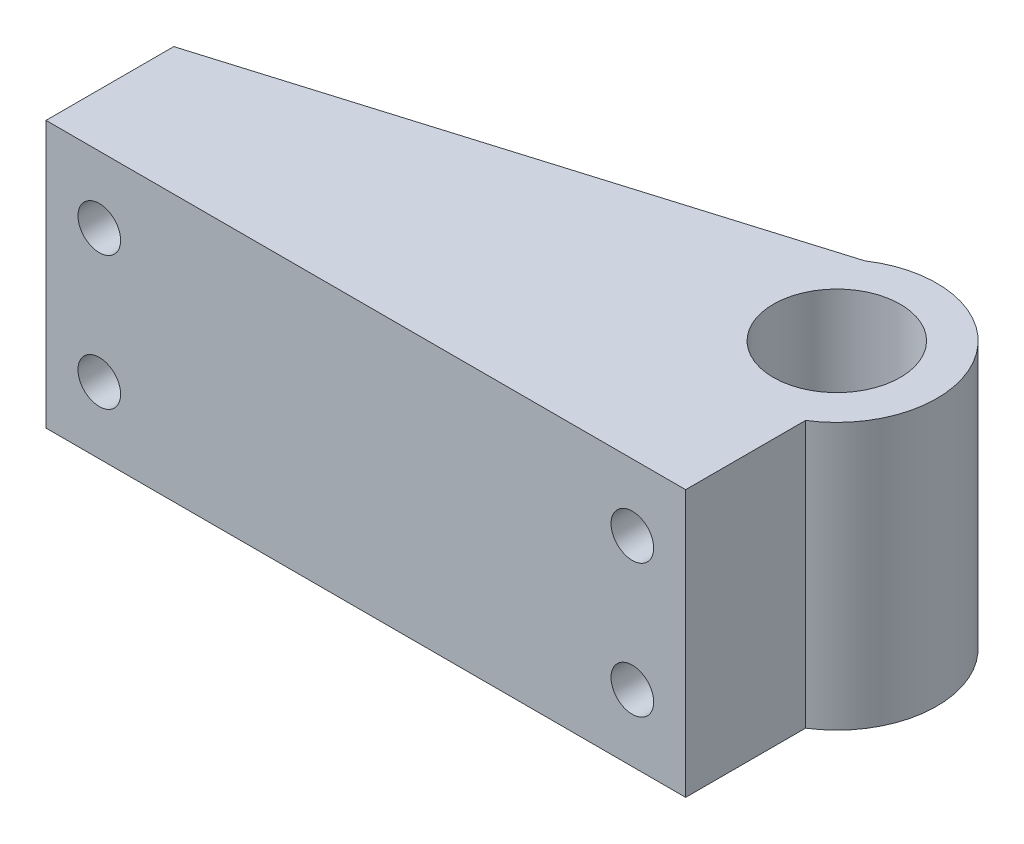
ISO-10303-21;
HEADER;
FILE_DESCRIPTION(('STEP AP214'),'2;1');
FILE_NAME('part.step','',(''),(''),'','','');
FILE_SCHEMA(('AUTOMOTIVE_DESIGN { 1 0 10303 214 1 1 1 1 }'));
ENDSEC;
DATA;
#1=APPLICATION_CONTEXT('core data for automotive mechanical design processes');
#2=APPLICATION_PROTOCOL_DEFINITION('international standard','automotive_design',2000,#1);
#3=PRODUCT_CONTEXT('',#1,'mechanical');
#4=PRODUCT('Part','Part','',(#3));
#5=PRODUCT_RELATED_PRODUCT_CATEGORY('part','',(#4));
#6=PRODUCT_DEFINITION_FORMATION('','',#4);
#7=PRODUCT_DEFINITION_CONTEXT('part definition',#1,'design');
#8=PRODUCT_DEFINITION('design','',#6,#7);
#9=PRODUCT_DEFINITION_SHAPE('','',#8);
#10=(LENGTH_UNIT() NAMED_UNIT(*) SI_UNIT(.MILLI.,.METRE.));
#11=(NAMED_UNIT(*) PLANE_ANGLE_UNIT() SI_UNIT($,.RADIAN.));
#12=(NAMED_UNIT(*) SI_UNIT($,.STERADIAN.) SOLID_ANGLE_UNIT());
#13=UNCERTAINTY_MEASURE_WITH_UNIT(LENGTH_MEASURE(1.E-05),#10,'distance_accuracy_value','');
#14=(GEOMETRIC_REPRESENTATION_CONTEXT(3) GLOBAL_UNCERTAINTY_ASSIGNED_CONTEXT((#13)) GLOBAL_UNIT_ASSIGNED_CONTEXT((#10,
#11,#12)) REPRESENTATION_CONTEXT('',''));
#15=CARTESIAN_POINT('',(0.,0.,0.));
#16=DIRECTION('',(0.,0.,1.));
#17=DIRECTION('',(1.,0.,0.));
#18=AXIS2_PLACEMENT_3D('',#15,#16,#17);
#19=CARTESIAN_POINT('',(0.,0.,0.));
#20=DIRECTION('',(0.,1.,0.));
#21=DIRECTION('',(0.,0.,1.));
#22=AXIS2_PLACEMENT_3D('',#19,#20,#21);
#23=PLANE('',#22);
#24=DIRECTION('',(1.,0.,0.));
#25=VECTOR('',#24,1.);
#26=CARTESIAN_POINT('',(0.,0.,19.4872467381854));
#27=LINE('',#26,#25);
#28=CARTESIAN_POINT('',(-55.88,0.,19.4872467381854));
#29=VERTEX_POINT('',#28);
#30=CARTESIAN_POINT('',(5.08,0.,19.4872467381854));
#31=VERTEX_POINT('',#30);
#32=EDGE_CURVE('E175',#29,#31,#27,.T.);
#33=ORIENTED_EDGE('',*,*,#32,.F.);
#34=DIRECTION('',(0.,0.,1.));
#35=VECTOR('',#34,1.);
#36=CARTESIAN_POINT('',(-55.88,0.,8.05724673818545));
#37=LINE('',#36,#35);
#38=CARTESIAN_POINT('',(-55.88,0.,7.3087196423991));
#39=VERTEX_POINT('',#38);
#40=EDGE_CURVE('E148',#39,#29,#37,.T.);
#41=ORIENTED_EDGE('',*,*,#40,.F.);
#42=DIRECTION('',(0.957496858882711,0.,-0.288443695077118));
#43=VECTOR('',#42,1.);
#44=CARTESIAN_POINT('',(-2.63065195230822,0.,-8.73252223618671));
#45=LINE('',#44,#43);
#46=CARTESIAN_POINT('',(-5.26130390461645,0.,-7.94004447237342));
#47=VERTEX_POINT('',#46);
#48=EDGE_CURVE('E135',#39,#47,#45,.T.);
#49=ORIENTED_EDGE('',*,*,#48,.T.);
#50=CARTESIAN_POINT('',(0.,0.,0.));
#51=DIRECTION('',(0.,1.,0.));
#52=DIRECTION('',(0.,0.,1.));
#53=AXIS2_PLACEMENT_3D('',#50,#51,#52);
#54=CIRCLE('',#53,9.525);
#55=CARTESIAN_POINT('',(5.08,0.,8.05724673818545));
#56=VERTEX_POINT('',#55);
#57=EDGE_CURVE('E208',#56,#47,#54,.T.);
#58=ORIENTED_EDGE('',*,*,#57,.F.);
#59=DIRECTION('',(0.,0.,1.));
#60=VECTOR('',#59,1.);
#61=CARTESIAN_POINT('',(5.08,0.,0.));
#62=LINE('',#61,#60);
#63=EDGE_CURVE('E176',#56,#31,#62,.T.);
#64=ORIENTED_EDGE('',*,*,#63,.T.);
#65=EDGE_LOOP('',(#33,#41,#49,#58,#64));
#66=FACE_BOUND('',#65,.T.);
#67=CARTESIAN_POINT('',(0.,0.,0.));
#68=DIRECTION('',(0.,1.,0.));
#69=DIRECTION('',(0.,0.,1.));
#70=AXIS2_PLACEMENT_3D('',#67,#68,#69);
#71=CIRCLE('',#70,6.049999965);
#72=CARTESIAN_POINT('',(0.,0.,6.049999965));
#73=VERTEX_POINT('',#72);
#74=EDGE_CURVE('E193',#73,#73,#71,.T.);
#75=ORIENTED_EDGE('',*,*,#74,.T.);
#76=EDGE_LOOP('',(#75));
#77=FACE_BOUND('',#76,.T.);
#78=ADVANCED_FACE('F126',(#66,#77),#23,.F.);
#79=CARTESIAN_POINT('',(0.,25.4,19.4872467381854));
#80=DIRECTION('',(0.,0.,-1.));
#81=DIRECTION('',(-1.,0.,0.));
#82=AXIS2_PLACEMENT_3D('',#79,#80,#81);
#83=PLANE('',#82);
#84=CARTESIAN_POINT('',(0.,6.35,19.4872467381854));
#85=DIRECTION('',(0.,0.,1.));
#86=DIRECTION('',(1.,0.,0.));
#87=AXIS2_PLACEMENT_3D('',#84,#85,#86);
#88=CIRCLE('',#87,2.032);
#89=CARTESIAN_POINT('',(2.032,6.35,19.4872467381854));
#90=VERTEX_POINT('',#89);
#91=EDGE_CURVE('E296',#90,#90,#88,.T.);
#92=ORIENTED_EDGE('',*,*,#91,.F.);
#93=EDGE_LOOP('',(#92));
#94=FACE_BOUND('',#93,.T.);
#95=CARTESIAN_POINT('',(-50.8,19.05,19.4872467381854));
#96=DIRECTION('',(0.,0.,1.));
#97=DIRECTION('',(1.,0.,0.));
#98=AXIS2_PLACEMENT_3D('',#95,#96,#97);
#99=CIRCLE('',#98,2.032);
#100=CARTESIAN_POINT('',(-48.768,19.05,19.4872467381854));
#101=VERTEX_POINT('',#100);
#102=EDGE_CURVE('E295',#101,#101,#99,.T.);
#103=ORIENTED_EDGE('',*,*,#102,.F.);
#104=EDGE_LOOP('',(#103));
#105=FACE_BOUND('',#104,.T.);
#106=CARTESIAN_POINT('',(-50.8,6.35,19.4872467381854));
#107=DIRECTION('',(0.,0.,1.));
#108=DIRECTION('',(1.,0.,0.));
#109=AXIS2_PLACEMENT_3D('',#106,#107,#108);
#110=CIRCLE('',#109,2.032);
#111=CARTESIAN_POINT('',(-48.768,6.35,19.4872467381854));
#112=VERTEX_POINT('',#111);
#113=EDGE_CURVE('E286',#112,#112,#110,.T.);
#114=ORIENTED_EDGE('',*,*,#113,.F.);
#115=EDGE_LOOP('',(#114));
#116=FACE_BOUND('',#115,.T.);
#117=CARTESIAN_POINT('',(0.,19.05,19.4872467381854));
#118=DIRECTION('',(0.,0.,1.));
#119=DIRECTION('',(1.,0.,0.));
#120=AXIS2_PLACEMENT_3D('',#117,#118,#119);
#121=CIRCLE('',#120,2.032);
#122=CARTESIAN_POINT('',(2.032,19.05,19.4872467381854));
#123=VERTEX_POINT('',#122);
#124=EDGE_CURVE('E301',#123,#123,#121,.T.);
#125=ORIENTED_EDGE('',*,*,#124,.F.);
#126=EDGE_LOOP('',(#125));
#127=FACE_BOUND('',#126,.T.);
#128=ORIENTED_EDGE('',*,*,#32,.T.);
#129=DIRECTION('',(0.,-1.,0.));
#130=VECTOR('',#129,1.);
#131=CARTESIAN_POINT('',(5.08,25.4,19.4872467381854));
#132=LINE('',#131,#130);
#133=CARTESIAN_POINT('',(5.08,25.4,19.4872467381854));
#134=VERTEX_POINT('',#133);
#135=EDGE_CURVE('E200',#134,#31,#132,.T.);
#136=ORIENTED_EDGE('',*,*,#135,.F.);
#137=DIRECTION('',(1.,0.,0.));
#138=VECTOR('',#137,1.);
#139=CARTESIAN_POINT('',(0.,25.4,19.4872467381854));
#140=LINE('',#139,#138);
#141=CARTESIAN_POINT('',(-55.88,25.4,19.4872467381854));
#142=VERTEX_POINT('',#141);
#143=EDGE_CURVE('E192',#142,#134,#140,.T.);
#144=ORIENTED_EDGE('',*,*,#143,.F.);
#145=DIRECTION('',(0.,1.,0.));
#146=VECTOR('',#145,1.);
#147=CARTESIAN_POINT('',(-55.88,0.,19.4872467381854));
#148=LINE('',#147,#146);
#149=EDGE_CURVE('E183',#29,#142,#148,.T.);
#150=ORIENTED_EDGE('',*,*,#149,.F.);
#151=EDGE_LOOP('',(#128,#136,#144,#150));
#152=FACE_BOUND('',#151,.T.);
#153=ADVANCED_FACE('F188',(#94,#105,#116,#127,#152),#83,.F.);
#154=CARTESIAN_POINT('',(0.,25.4,0.));
#155=DIRECTION('',(0.,1.,0.));
#156=DIRECTION('',(0.,0.,1.));
#157=AXIS2_PLACEMENT_3D('',#154,#155,#156);
#158=PLANE('',#157);
#159=ORIENTED_EDGE('',*,*,#143,.T.);
#160=DIRECTION('',(0.,0.,1.));
#161=VECTOR('',#160,1.);
#162=CARTESIAN_POINT('',(5.08,25.4,0.));
#163=LINE('',#162,#161);
#164=CARTESIAN_POINT('',(5.08,25.4,8.05724673818545));
#165=VERTEX_POINT('',#164);
#166=EDGE_CURVE('E181',#165,#134,#163,.T.);
#167=ORIENTED_EDGE('',*,*,#166,.F.);
#168=CARTESIAN_POINT('',(0.,25.4,0.));
#169=DIRECTION('',(0.,1.,0.));
#170=DIRECTION('',(0.,0.,1.));
#171=AXIS2_PLACEMENT_3D('',#168,#169,#170);
#172=CIRCLE('',#171,9.525);
#173=CARTESIAN_POINT('',(-5.26130390461645,25.4,-7.94004447237342));
#174=VERTEX_POINT('',#173);
#175=EDGE_CURVE('E202',#165,#174,#172,.T.);
#176=ORIENTED_EDGE('',*,*,#175,.T.);
#177=DIRECTION('',(-0.957496858882711,0.,0.288443695077118));
#178=VECTOR('',#177,1.);
#179=CARTESIAN_POINT('',(-58.3647564888267,25.4,8.05724673818545));
#180=LINE('',#179,#178);
#181=CARTESIAN_POINT('',(-55.88,25.4,7.3087196423991));
#182=VERTEX_POINT('',#181);
#183=EDGE_CURVE('E12',#174,#182,#180,.T.);
#184=ORIENTED_EDGE('',*,*,#183,.T.);
#185=DIRECTION('',(0.,0.,-1.));
#186=VECTOR('',#185,1.);
#187=CARTESIAN_POINT('',(-55.88,25.4,8.05724673818545));
#188=LINE('',#187,#186);
#189=EDGE_CURVE('E145',#142,#182,#188,.T.);
#190=ORIENTED_EDGE('',*,*,#189,.F.);
#191=EDGE_LOOP('',(#159,#167,#176,#184,#190));
#192=FACE_BOUND('',#191,.T.);
#193=CARTESIAN_POINT('',(0.,25.4,0.));
#194=DIRECTION('',(0.,1.,0.));
#195=DIRECTION('',(0.,0.,1.));
#196=AXIS2_PLACEMENT_3D('',#193,#194,#195);
#197=CIRCLE('',#196,6.049999965);
#198=CARTESIAN_POINT('',(0.,25.4,6.049999965));
#199=VERTEX_POINT('',#198);
#200=EDGE_CURVE('E210',#199,#199,#197,.T.);
#201=ORIENTED_EDGE('',*,*,#200,.F.);
#202=EDGE_LOOP('',(#201));
#203=FACE_BOUND('',#202,.T.);
#204=ADVANCED_FACE('F223',(#192,#203),#158,.T.);
#205=CARTESIAN_POINT('',(5.08,25.4,0.));
#206=DIRECTION('',(1.,0.,0.));
#207=DIRECTION('',(0.,0.,-1.));
#208=AXIS2_PLACEMENT_3D('',#205,#206,#207);
#209=PLANE('',#208);
#210=ORIENTED_EDGE('',*,*,#166,.T.);
#211=ORIENTED_EDGE('',*,*,#135,.T.);
#212=ORIENTED_EDGE('',*,*,#63,.F.);
#213=DIRECTION('',(0.,-1.,0.));
#214=VECTOR('',#213,1.);
#215=CARTESIAN_POINT('',(5.08,25.4,8.05724673818545));
#216=LINE('',#215,#214);
#217=EDGE_CURVE('E201',#165,#56,#216,.T.);
#218=ORIENTED_EDGE('',*,*,#217,.F.);
#219=EDGE_LOOP('',(#210,#211,#212,#218));
#220=FACE_BOUND('',#219,.T.);
#221=ADVANCED_FACE('F230',(#220),#209,.T.);
#222=CARTESIAN_POINT('',(0.,25.4,0.));
#223=DIRECTION('',(0.,-1.,0.));
#224=DIRECTION('',(0.,0.,-1.));
#225=AXIS2_PLACEMENT_3D('',#222,#223,#224);
#226=CYLINDRICAL_SURFACE('',#225,6.049999965);
#227=ORIENTED_EDGE('',*,*,#200,.T.);
#228=EDGE_LOOP('',(#227));
#229=FACE_BOUND('',#228,.T.);
#230=ORIENTED_EDGE('',*,*,#74,.F.);
#231=EDGE_LOOP('',(#230));
#232=FACE_BOUND('',#231,.T.);
#233=ADVANCED_FACE('F233',(#229,#232),#226,.F.);
#234=CARTESIAN_POINT('',(0.,25.4,0.));
#235=DIRECTION('',(0.,-1.,0.));
#236=DIRECTION('',(0.,0.,-1.));
#237=AXIS2_PLACEMENT_3D('',#234,#235,#236);
#238=CYLINDRICAL_SURFACE('',#237,9.525);
#239=ORIENTED_EDGE('',*,*,#57,.T.);
#240=DIRECTION('',(0.,-1.,0.));
#241=VECTOR('',#240,1.);
#242=CARTESIAN_POINT('',(-5.26130390461645,25.4,-7.94004447237342));
#243=LINE('',#242,#241);
#244=EDGE_CURVE('E207',#47,#174,#243,.F.);
#245=ORIENTED_EDGE('',*,*,#244,.T.);
#246=ORIENTED_EDGE('',*,*,#175,.F.);
#247=ORIENTED_EDGE('',*,*,#217,.T.);
#248=EDGE_LOOP('',(#239,#245,#246,#247));
#249=FACE_BOUND('',#248,.T.);
#250=ADVANCED_FACE('F224',(#249),#238,.T.);
#251=CARTESIAN_POINT('',(-55.88,0.,0.));
#252=DIRECTION('',(1.,0.,0.));
#253=DIRECTION('',(0.,0.,-1.));
#254=AXIS2_PLACEMENT_3D('',#251,#252,#253);
#255=PLANE('',#254);
#256=ORIENTED_EDGE('',*,*,#189,.T.);
#257=DIRECTION('',(0.,-1.,0.));
#258=VECTOR('',#257,1.);
#259=CARTESIAN_POINT('',(-55.88,0.,7.3087196423991));
#260=LINE('',#259,#258);
#261=EDGE_CURVE('E187',#182,#39,#260,.T.);
#262=ORIENTED_EDGE('',*,*,#261,.T.);
#263=ORIENTED_EDGE('',*,*,#40,.T.);
#264=ORIENTED_EDGE('',*,*,#149,.T.);
#265=EDGE_LOOP('',(#256,#262,#263,#264));
#266=FACE_BOUND('',#265,.T.);
#267=ADVANCED_FACE('F182',(#266),#255,.F.);
#268=CARTESIAN_POINT('',(-58.3647564888267,25.4,8.05724673818545));
#269=DIRECTION('',(0.288443695077118,0.,0.957496858882711));
#270=DIRECTION('',(0.,-1.,0.));
#271=AXIS2_PLACEMENT_3D('',#268,#269,#270);
#272=PLANE('',#271);
#273=ORIENTED_EDGE('',*,*,#183,.F.);
#274=ORIENTED_EDGE('',*,*,#244,.F.);
#275=ORIENTED_EDGE('',*,*,#48,.F.);
#276=ORIENTED_EDGE('',*,*,#261,.F.);
#277=EDGE_LOOP('',(#273,#274,#275,#276));
#278=FACE_BOUND('',#277,.T.);
#279=ADVANCED_FACE('F128',(#278),#272,.F.);
#280=CARTESIAN_POINT('',(0.,19.05,6.78724673818545));
#281=DIRECTION('',(0.,0.,1.));
#282=DIRECTION('',(1.,0.,0.));
#283=AXIS2_PLACEMENT_3D('',#280,#281,#282);
#284=CYLINDRICAL_SURFACE('',#283,2.032);
#285=CARTESIAN_POINT('',(0.,19.05,6.78724673818545));
#286=DIRECTION('',(0.,0.,1.));
#287=DIRECTION('',(1.,0.,0.));
#288=AXIS2_PLACEMENT_3D('',#285,#286,#287);
#289=CIRCLE('',#288,2.032);
#290=CARTESIAN_POINT('',(2.032,19.05,6.78724673818545));
#291=VERTEX_POINT('',#290);
#292=EDGE_CURVE('E189',#291,#291,#289,.T.);
#293=ORIENTED_EDGE('',*,*,#292,.F.);
#294=EDGE_LOOP('',(#293));
#295=FACE_BOUND('',#294,.T.);
#296=ORIENTED_EDGE('',*,*,#124,.T.);
#297=EDGE_LOOP('',(#296));
#298=FACE_BOUND('',#297,.T.);
#299=ADVANCED_FACE('F249',(#295,#298),#284,.F.);
#300=CARTESIAN_POINT('',(0.,19.05,6.78724673818545));
#301=DIRECTION('',(0.,0.,1.));
#302=DIRECTION('',(1.,0.,0.));
#303=AXIS2_PLACEMENT_3D('',#300,#301,#302);
#304=PLANE('',#303);
#305=ORIENTED_EDGE('',*,*,#292,.T.);
#306=EDGE_LOOP('',(#305));
#307=FACE_BOUND('',#306,.T.);
#308=ADVANCED_FACE('F254',(#307),#304,.T.);
#309=CARTESIAN_POINT('',(-50.8,6.35,6.78724673818545));
#310=DIRECTION('',(0.,0.,1.));
#311=DIRECTION('',(1.,0.,0.));
#312=AXIS2_PLACEMENT_3D('',#309,#310,#311);
#313=CYLINDRICAL_SURFACE('',#312,2.032);
#314=CARTESIAN_POINT('',(-50.8,6.35,6.78724673818545));
#315=DIRECTION('',(0.,0.,1.));
#316=DIRECTION('',(1.,0.,0.));
#317=AXIS2_PLACEMENT_3D('',#314,#315,#316);
#318=CIRCLE('',#317,2.032);
#319=CARTESIAN_POINT('',(-48.768,6.35,6.78724673818545));
#320=VERTEX_POINT('',#319);
#321=EDGE_CURVE('E287',#320,#320,#318,.T.);
#322=ORIENTED_EDGE('',*,*,#321,.F.);
#323=EDGE_LOOP('',(#322));
#324=FACE_BOUND('',#323,.T.);
#325=ORIENTED_EDGE('',*,*,#113,.T.);
#326=EDGE_LOOP('',(#325));
#327=FACE_BOUND('',#326,.T.);
#328=ADVANCED_FACE('F257',(#324,#327),#313,.F.);
#329=CARTESIAN_POINT('',(-50.8,6.35,6.78724673818545));
#330=DIRECTION('',(0.,0.,1.));
#331=DIRECTION('',(1.,0.,0.));
#332=AXIS2_PLACEMENT_3D('',#329,#330,#331);
#333=PLANE('',#332);
#334=ORIENTED_EDGE('',*,*,#321,.T.);
#335=EDGE_LOOP('',(#334));
#336=FACE_BOUND('',#335,.T.);
#337=ADVANCED_FACE('F269',(#336),#333,.T.);
#338=CARTESIAN_POINT('',(-50.8,19.05,6.78724673818545));
#339=DIRECTION('',(0.,0.,1.));
#340=DIRECTION('',(1.,0.,0.));
#341=AXIS2_PLACEMENT_3D('',#338,#339,#340);
#342=CYLINDRICAL_SURFACE('',#341,2.032);
#343=CARTESIAN_POINT('',(-50.8,19.05,6.78724673818545));
#344=DIRECTION('',(0.,0.,1.));
#345=DIRECTION('',(1.,0.,0.));
#346=AXIS2_PLACEMENT_3D('',#343,#344,#345);
#347=CIRCLE('',#346,2.032);
#348=CARTESIAN_POINT('',(-48.768,19.05,6.78724673818545));
#349=VERTEX_POINT('',#348);
#350=EDGE_CURVE('E293',#349,#349,#347,.T.);
#351=ORIENTED_EDGE('',*,*,#350,.F.);
#352=EDGE_LOOP('',(#351));
#353=FACE_BOUND('',#352,.T.);
#354=ORIENTED_EDGE('',*,*,#102,.T.);
#355=EDGE_LOOP('',(#354));
#356=FACE_BOUND('',#355,.T.);
#357=ADVANCED_FACE('F264',(#353,#356),#342,.F.);
#358=CARTESIAN_POINT('',(-50.8,19.05,6.78724673818545));
#359=DIRECTION('',(0.,0.,1.));
#360=DIRECTION('',(1.,0.,0.));
#361=AXIS2_PLACEMENT_3D('',#358,#359,#360);
#362=PLANE('',#361);
#363=ORIENTED_EDGE('',*,*,#350,.T.);
#364=EDGE_LOOP('',(#363));
#365=FACE_BOUND('',#364,.T.);
#366=ADVANCED_FACE('F258',(#365),#362,.T.);
#367=CARTESIAN_POINT('',(0.,6.35,6.78724673818545));
#368=DIRECTION('',(0.,0.,1.));
#369=DIRECTION('',(1.,0.,0.));
#370=AXIS2_PLACEMENT_3D('',#367,#368,#369);
#371=CYLINDRICAL_SURFACE('',#370,2.032);
#372=CARTESIAN_POINT('',(0.,6.35,6.78724673818545));
#373=DIRECTION('',(0.,0.,1.));
#374=DIRECTION('',(1.,0.,0.));
#375=AXIS2_PLACEMENT_3D('',#372,#373,#374);
#376=CIRCLE('',#375,2.032);
#377=CARTESIAN_POINT('',(2.032,6.35,6.78724673818545));
#378=VERTEX_POINT('',#377);
#379=EDGE_CURVE('E305',#378,#378,#376,.T.);
#380=ORIENTED_EDGE('',*,*,#379,.F.);
#381=EDGE_LOOP('',(#380));
#382=FACE_BOUND('',#381,.T.);
#383=ORIENTED_EDGE('',*,*,#91,.T.);
#384=EDGE_LOOP('',(#383));
#385=FACE_BOUND('',#384,.T.);
#386=ADVANCED_FACE('F262',(#382,#385),#371,.F.);
#387=CARTESIAN_POINT('',(0.,6.35,6.78724673818545));
#388=DIRECTION('',(0.,0.,1.));
#389=DIRECTION('',(1.,0.,0.));
#390=AXIS2_PLACEMENT_3D('',#387,#388,#389);
#391=PLANE('',#390);
#392=ORIENTED_EDGE('',*,*,#379,.T.);
#393=EDGE_LOOP('',(#392));
#394=FACE_BOUND('',#393,.T.);
#395=ADVANCED_FACE('F266',(#394),#391,.T.);
#396=CLOSED_SHELL('',(#78,#153,#204,#221,#233,#250,#267,#279,#299,#308,#328,#337,#357,#366,#386,#395));
#397=MANIFOLD_SOLID_BREP('B2',#396);
#398=ADVANCED_BREP_SHAPE_REPRESENTATION('',(#18,#397),#14);
#399=SHAPE_DEFINITION_REPRESENTATION(#9,#398);
ENDSEC;
END-ISO-10303-21;
